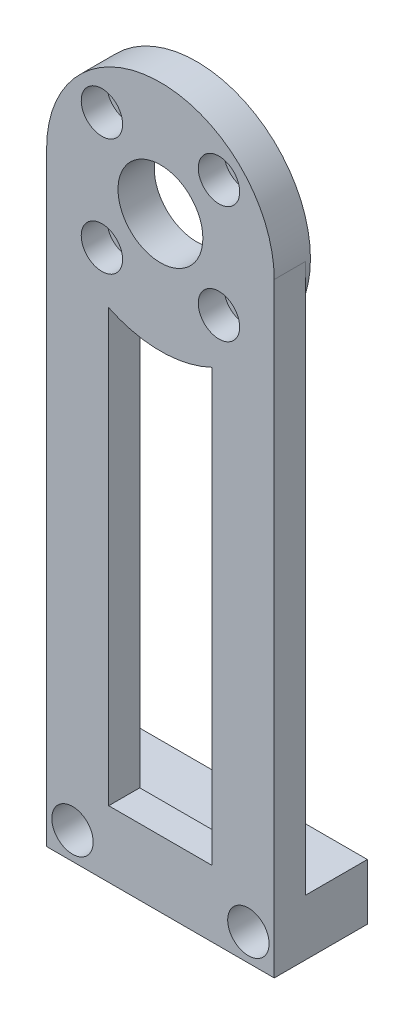
ISO-10303-21;
HEADER;
FILE_DESCRIPTION(('STEP AP214'),'2;1');
FILE_NAME('part.step','',(''),(''),'','','');
FILE_SCHEMA(('AUTOMOTIVE_DESIGN { 1 0 10303 214 1 1 1 1 }'));
ENDSEC;
DATA;
#1=APPLICATION_CONTEXT('core data for automotive mechanical design processes');
#2=APPLICATION_PROTOCOL_DEFINITION('international standard','automotive_design',2000,#1);
#3=PRODUCT_CONTEXT('',#1,'mechanical');
#4=PRODUCT('Part','Part','',(#3));
#5=PRODUCT_RELATED_PRODUCT_CATEGORY('part','',(#4));
#6=PRODUCT_DEFINITION_FORMATION('','',#4);
#7=PRODUCT_DEFINITION_CONTEXT('part definition',#1,'design');
#8=PRODUCT_DEFINITION('design','',#6,#7);
#9=PRODUCT_DEFINITION_SHAPE('','',#8);
#10=(LENGTH_UNIT() NAMED_UNIT(*) SI_UNIT(.MILLI.,.METRE.));
#11=(NAMED_UNIT(*) PLANE_ANGLE_UNIT() SI_UNIT($,.RADIAN.));
#12=(NAMED_UNIT(*) SI_UNIT($,.STERADIAN.) SOLID_ANGLE_UNIT());
#13=UNCERTAINTY_MEASURE_WITH_UNIT(LENGTH_MEASURE(1.E-05),#10,'distance_accuracy_value','');
#14=(GEOMETRIC_REPRESENTATION_CONTEXT(3) GLOBAL_UNCERTAINTY_ASSIGNED_CONTEXT((#13)) GLOBAL_UNIT_ASSIGNED_CONTEXT((#10,
#11,#12)) REPRESENTATION_CONTEXT('',''));
#15=CARTESIAN_POINT('',(0.,0.,0.));
#16=DIRECTION('',(0.,0.,1.));
#17=DIRECTION('',(1.,0.,0.));
#18=AXIS2_PLACEMENT_3D('',#15,#16,#17);
#19=CARTESIAN_POINT('',(8.5,-26.62018786,-9.11126983722081));
#20=DIRECTION('',(0.,0.,1.));
#21=DIRECTION('',(1.,0.,0.));
#22=AXIS2_PLACEMENT_3D('',#19,#20,#21);
#23=CYLINDRICAL_SURFACE('',#22,1.1);
#24=CARTESIAN_POINT('',(8.5,-26.62018786,-6.));
#25=DIRECTION('',(0.,0.,1.));
#26=DIRECTION('',(1.,0.,0.));
#27=AXIS2_PLACEMENT_3D('',#24,#25,#26);
#28=CIRCLE('',#27,1.1);
#29=CARTESIAN_POINT('',(9.6,-26.62018786,-6.));
#30=VERTEX_POINT('',#29);
#31=EDGE_CURVE('E182',#30,#30,#28,.F.);
#32=ORIENTED_EDGE('',*,*,#31,.T.);
#33=EDGE_LOOP('',(#32));
#34=FACE_BOUND('',#33,.T.);
#35=CARTESIAN_POINT('',(8.5,-26.62018786,-5.));
#36=DIRECTION('',(0.,0.,1.));
#37=DIRECTION('',(1.,0.,0.));
#38=AXIS2_PLACEMENT_3D('',#35,#36,#37);
#39=CIRCLE('',#38,1.1);
#40=CARTESIAN_POINT('',(9.6,-26.62018786,-5.));
#41=VERTEX_POINT('',#40);
#42=EDGE_CURVE('E726',#41,#41,#39,.F.);
#43=ORIENTED_EDGE('',*,*,#42,.F.);
#44=EDGE_LOOP('',(#43));
#45=FACE_BOUND('',#44,.T.);
#46=ADVANCED_FACE('F73',(#34,#45),#23,.F.);
#47=CARTESIAN_POINT('',(-8.5,-26.62018786,-9.11126983722081));
#48=DIRECTION('',(0.,0.,1.));
#49=DIRECTION('',(1.,0.,0.));
#50=AXIS2_PLACEMENT_3D('',#47,#48,#49);
#51=CYLINDRICAL_SURFACE('',#50,1.1);
#52=CARTESIAN_POINT('',(-8.5,-26.62018786,-6.));
#53=DIRECTION('',(0.,0.,1.));
#54=DIRECTION('',(1.,0.,0.));
#55=AXIS2_PLACEMENT_3D('',#52,#53,#54);
#56=CIRCLE('',#55,1.1);
#57=CARTESIAN_POINT('',(-7.4,-26.62018786,-6.));
#58=VERTEX_POINT('',#57);
#59=EDGE_CURVE('E179',#58,#58,#56,.F.);
#60=ORIENTED_EDGE('',*,*,#59,.T.);
#61=EDGE_LOOP('',(#60));
#62=FACE_BOUND('',#61,.T.);
#63=CARTESIAN_POINT('',(-8.5,-26.62018786,-5.));
#64=DIRECTION('',(0.,0.,1.));
#65=DIRECTION('',(1.,0.,0.));
#66=AXIS2_PLACEMENT_3D('',#63,#64,#65);
#67=CIRCLE('',#66,1.1);
#68=CARTESIAN_POINT('',(-7.4,-26.62018786,-5.));
#69=VERTEX_POINT('',#68);
#70=EDGE_CURVE('E742',#69,#69,#67,.F.);
#71=ORIENTED_EDGE('',*,*,#70,.F.);
#72=EDGE_LOOP('',(#71));
#73=FACE_BOUND('',#72,.T.);
#74=ADVANCED_FACE('F390',(#62,#73),#51,.F.);
#75=CARTESIAN_POINT('',(-5.65685424949235,23.5781457505076,-12.0965512114594));
#76=DIRECTION('',(0.,0.,1.));
#77=DIRECTION('',(1.,0.,0.));
#78=AXIS2_PLACEMENT_3D('',#75,#76,#77);
#79=CYLINDRICAL_SURFACE('',#78,1.10000000000001);
#80=CARTESIAN_POINT('',(-5.65685424949235,23.5781457505076,-0.5));
#81=DIRECTION('',(0.,0.,1.));
#82=DIRECTION('',(1.,0.,0.));
#83=AXIS2_PLACEMENT_3D('',#80,#81,#82);
#84=CIRCLE('',#83,1.10000000000001);
#85=CARTESIAN_POINT('',(-4.55685424949234,23.5781457505076,-0.5));
#86=VERTEX_POINT('',#85);
#87=EDGE_CURVE('E234',#86,#86,#84,.F.);
#88=ORIENTED_EDGE('',*,*,#87,.T.);
#89=EDGE_LOOP('',(#88));
#90=FACE_BOUND('',#89,.T.);
#91=CARTESIAN_POINT('',(-5.65685424949235,23.5781457505076,0.5));
#92=DIRECTION('',(0.,0.,1.));
#93=DIRECTION('',(1.,0.,0.));
#94=AXIS2_PLACEMENT_3D('',#91,#92,#93);
#95=CIRCLE('',#94,1.10000000000001);
#96=CARTESIAN_POINT('',(-4.55685424949234,23.5781457505076,0.5));
#97=VERTEX_POINT('',#96);
#98=EDGE_CURVE('E216',#97,#97,#95,.F.);
#99=ORIENTED_EDGE('',*,*,#98,.F.);
#100=EDGE_LOOP('',(#99));
#101=FACE_BOUND('',#100,.T.);
#102=ADVANCED_FACE('F396',(#90,#101),#79,.F.);
#103=CARTESIAN_POINT('',(-5.65685424949244,34.8918542494923,-12.0965512114594));
#104=DIRECTION('',(0.,0.,1.));
#105=DIRECTION('',(1.,0.,0.));
#106=AXIS2_PLACEMENT_3D('',#103,#104,#105);
#107=CYLINDRICAL_SURFACE('',#106,1.10000000000001);
#108=CARTESIAN_POINT('',(-5.65685424949244,34.8918542494923,-0.5));
#109=DIRECTION('',(0.,0.,1.));
#110=DIRECTION('',(1.,0.,0.));
#111=AXIS2_PLACEMENT_3D('',#108,#109,#110);
#112=CIRCLE('',#111,1.10000000000001);
#113=CARTESIAN_POINT('',(-4.55685424949243,34.8918542494923,-0.5));
#114=VERTEX_POINT('',#113);
#115=EDGE_CURVE('E238',#114,#114,#112,.F.);
#116=ORIENTED_EDGE('',*,*,#115,.T.);
#117=EDGE_LOOP('',(#116));
#118=FACE_BOUND('',#117,.T.);
#119=CARTESIAN_POINT('',(-5.65685424949244,34.8918542494923,0.5));
#120=DIRECTION('',(0.,0.,1.));
#121=DIRECTION('',(1.,0.,0.));
#122=AXIS2_PLACEMENT_3D('',#119,#120,#121);
#123=CIRCLE('',#122,1.10000000000001);
#124=CARTESIAN_POINT('',(-4.55685424949243,34.8918542494923,0.5));
#125=VERTEX_POINT('',#124);
#126=EDGE_CURVE('E203',#125,#125,#123,.F.);
#127=ORIENTED_EDGE('',*,*,#126,.F.);
#128=EDGE_LOOP('',(#127));
#129=FACE_BOUND('',#128,.T.);
#130=ADVANCED_FACE('F436',(#118,#129),#107,.F.);
#131=CARTESIAN_POINT('',(5.65685424949247,23.5781457505077,-12.0965512114594));
#132=DIRECTION('',(0.,0.,1.));
#133=DIRECTION('',(1.,0.,0.));
#134=AXIS2_PLACEMENT_3D('',#131,#132,#133);
#135=CYLINDRICAL_SURFACE('',#134,1.10000000000001);
#136=CARTESIAN_POINT('',(5.65685424949247,23.5781457505077,-0.5));
#137=DIRECTION('',(0.,0.,1.));
#138=DIRECTION('',(1.,0.,0.));
#139=AXIS2_PLACEMENT_3D('',#136,#137,#138);
#140=CIRCLE('',#139,1.10000000000001);
#141=CARTESIAN_POINT('',(6.75685424949248,23.5781457505077,-0.5));
#142=VERTEX_POINT('',#141);
#143=EDGE_CURVE('E211',#142,#142,#140,.F.);
#144=ORIENTED_EDGE('',*,*,#143,.T.);
#145=EDGE_LOOP('',(#144));
#146=FACE_BOUND('',#145,.T.);
#147=CARTESIAN_POINT('',(5.65685424949247,23.5781457505077,0.5));
#148=DIRECTION('',(0.,0.,1.));
#149=DIRECTION('',(1.,0.,0.));
#150=AXIS2_PLACEMENT_3D('',#147,#148,#149);
#151=CIRCLE('',#150,1.10000000000001);
#152=CARTESIAN_POINT('',(6.75685424949248,23.5781457505077,0.5));
#153=VERTEX_POINT('',#152);
#154=EDGE_CURVE('E195',#153,#153,#151,.F.);
#155=ORIENTED_EDGE('',*,*,#154,.F.);
#156=EDGE_LOOP('',(#155));
#157=FACE_BOUND('',#156,.T.);
#158=ADVANCED_FACE('F440',(#146,#157),#135,.F.);
#159=CARTESIAN_POINT('',(5.65685424949235,34.8918542494924,-12.0965512114594));
#160=DIRECTION('',(0.,0.,1.));
#161=DIRECTION('',(1.,0.,0.));
#162=AXIS2_PLACEMENT_3D('',#159,#160,#161);
#163=CYLINDRICAL_SURFACE('',#162,1.10000000000001);
#164=CARTESIAN_POINT('',(5.65685424949235,34.8918542494924,-0.5));
#165=DIRECTION('',(0.,0.,1.));
#166=DIRECTION('',(1.,0.,0.));
#167=AXIS2_PLACEMENT_3D('',#164,#165,#166);
#168=CIRCLE('',#167,1.10000000000001);
#169=CARTESIAN_POINT('',(6.75685424949236,34.8918542494924,-0.5));
#170=VERTEX_POINT('',#169);
#171=EDGE_CURVE('E257',#170,#170,#168,.F.);
#172=ORIENTED_EDGE('',*,*,#171,.T.);
#173=EDGE_LOOP('',(#172));
#174=FACE_BOUND('',#173,.T.);
#175=CARTESIAN_POINT('',(5.65685424949235,34.8918542494924,0.5));
#176=DIRECTION('',(0.,0.,1.));
#177=DIRECTION('',(1.,0.,0.));
#178=AXIS2_PLACEMENT_3D('',#175,#176,#177);
#179=CIRCLE('',#178,1.10000000000001);
#180=CARTESIAN_POINT('',(6.75685424949236,34.8918542494924,0.5));
#181=VERTEX_POINT('',#180);
#182=EDGE_CURVE('E242',#181,#181,#179,.F.);
#183=ORIENTED_EDGE('',*,*,#182,.F.);
#184=EDGE_LOOP('',(#183));
#185=FACE_BOUND('',#184,.T.);
#186=ADVANCED_FACE('F352',(#174,#185),#163,.F.);
#187=CARTESIAN_POINT('',(0.,0.,0.));
#188=DIRECTION('',(0.,0.,1.));
#189=DIRECTION('',(1.,0.,0.));
#190=AXIS2_PLACEMENT_3D('',#187,#188,#189);
#191=PLANE('',#190);
#192=DIRECTION('',(0.,-1.,0.));
#193=VECTOR('',#192,1.);
#194=CARTESIAN_POINT('',(11.,0.,0.));
#195=LINE('',#194,#193);
#196=CARTESIAN_POINT('',(11.,29.235,0.));
#197=VERTEX_POINT('',#196);
#198=CARTESIAN_POINT('',(11.,-23.815,0.));
#199=VERTEX_POINT('',#198);
#200=EDGE_CURVE('E95',#197,#199,#195,.T.);
#201=ORIENTED_EDGE('',*,*,#200,.T.);
#202=DIRECTION('',(-1.,0.,0.));
#203=VECTOR('',#202,1.);
#204=CARTESIAN_POINT('',(0.,-23.815,0.));
#205=LINE('',#204,#203);
#206=CARTESIAN_POINT('',(-11.,-23.815,0.));
#207=VERTEX_POINT('',#206);
#208=EDGE_CURVE('E91',#199,#207,#205,.T.);
#209=ORIENTED_EDGE('',*,*,#208,.T.);
#210=DIRECTION('',(0.,-1.,0.));
#211=VECTOR('',#210,1.);
#212=CARTESIAN_POINT('',(-11.,0.,0.));
#213=LINE('',#212,#211);
#214=CARTESIAN_POINT('',(-11.,29.235,0.));
#215=VERTEX_POINT('',#214);
#216=EDGE_CURVE('E301',#215,#207,#213,.T.);
#217=ORIENTED_EDGE('',*,*,#216,.F.);
#218=CARTESIAN_POINT('',(0.,29.235,0.));
#219=DIRECTION('',(0.,0.,1.));
#220=DIRECTION('',(1.,0.,0.));
#221=AXIS2_PLACEMENT_3D('',#218,#219,#220);
#222=CIRCLE('',#221,11.);
#223=EDGE_CURVE('E13',#215,#197,#222,.T.);
#224=ORIENTED_EDGE('',*,*,#223,.T.);
#225=EDGE_LOOP('',(#201,#209,#217,#224));
#226=FACE_BOUND('',#225,.T.);
#227=CARTESIAN_POINT('',(0.,29.235,0.));
#228=DIRECTION('',(0.,0.,1.));
#229=DIRECTION('',(1.,0.,0.));
#230=AXIS2_PLACEMENT_3D('',#227,#228,#229);
#231=CIRCLE('',#230,11.5);
#232=CARTESIAN_POINT('',(-5.,18.878842411396,0.));
#233=VERTEX_POINT('',#232);
#234=CARTESIAN_POINT('',(4.99999999999999,18.878842411396,0.));
#235=VERTEX_POINT('',#234);
#236=EDGE_CURVE('E304',#233,#235,#231,.T.);
#237=ORIENTED_EDGE('',*,*,#236,.F.);
#238=DIRECTION('',(0.,-1.,0.));
#239=VECTOR('',#238,1.);
#240=CARTESIAN_POINT('',(-4.99999999999999,0.,0.));
#241=LINE('',#240,#239);
#242=CARTESIAN_POINT('',(-4.99999999999998,-22.815,0.));
#243=VERTEX_POINT('',#242);
#244=EDGE_CURVE('E275',#233,#243,#241,.T.);
#245=ORIENTED_EDGE('',*,*,#244,.T.);
#246=DIRECTION('',(1.,0.,0.));
#247=VECTOR('',#246,1.);
#248=CARTESIAN_POINT('',(0.,-22.815,0.));
#249=LINE('',#248,#247);
#250=CARTESIAN_POINT('',(5.00000000000002,-22.815,0.));
#251=VERTEX_POINT('',#250);
#252=EDGE_CURVE('E312',#243,#251,#249,.T.);
#253=ORIENTED_EDGE('',*,*,#252,.T.);
#254=DIRECTION('',(0.,-1.,0.));
#255=VECTOR('',#254,1.);
#256=CARTESIAN_POINT('',(5.,0.,0.));
#257=LINE('',#256,#255);
#258=EDGE_CURVE('E308',#235,#251,#257,.T.);
#259=ORIENTED_EDGE('',*,*,#258,.F.);
#260=EDGE_LOOP('',(#237,#245,#253,#259));
#261=FACE_BOUND('',#260,.T.);
#262=ADVANCED_FACE('F349',(#226,#261),#191,.F.);
#263=CARTESIAN_POINT('',(0.,-29.235,3.));
#264=DIRECTION('',(0.,1.,0.));
#265=DIRECTION('',(0.,0.,1.));
#266=AXIS2_PLACEMENT_3D('',#263,#264,#265);
#267=PLANE('',#266);
#268=DIRECTION('',(0.,0.,-1.));
#269=VECTOR('',#268,1.);
#270=CARTESIAN_POINT('',(-11.,-29.235,3.));
#271=LINE('',#270,#269);
#272=CARTESIAN_POINT('',(-11.,-29.235,3.));
#273=VERTEX_POINT('',#272);
#274=CARTESIAN_POINT('',(-11.,-29.235,-6.));
#275=VERTEX_POINT('',#274);
#276=EDGE_CURVE('E175',#273,#275,#271,.T.);
#277=ORIENTED_EDGE('',*,*,#276,.T.);
#278=DIRECTION('',(1.,0.,0.));
#279=VECTOR('',#278,1.);
#280=CARTESIAN_POINT('',(0.,-29.235,-6.));
#281=LINE('',#280,#279);
#282=CARTESIAN_POINT('',(11.,-29.235,-6.));
#283=VERTEX_POINT('',#282);
#284=EDGE_CURVE('E167',#275,#283,#281,.T.);
#285=ORIENTED_EDGE('',*,*,#284,.T.);
#286=DIRECTION('',(0.,0.,-1.));
#287=VECTOR('',#286,1.);
#288=CARTESIAN_POINT('',(11.,-29.235,3.));
#289=LINE('',#288,#287);
#290=CARTESIAN_POINT('',(11.,-29.235,3.));
#291=VERTEX_POINT('',#290);
#292=EDGE_CURVE('E77',#291,#283,#289,.T.);
#293=ORIENTED_EDGE('',*,*,#292,.F.);
#294=DIRECTION('',(1.,0.,0.));
#295=VECTOR('',#294,1.);
#296=CARTESIAN_POINT('',(0.,-29.235,3.));
#297=LINE('',#296,#295);
#298=EDGE_CURVE('E281',#273,#291,#297,.T.);
#299=ORIENTED_EDGE('',*,*,#298,.F.);
#300=EDGE_LOOP('',(#277,#285,#293,#299));
#301=FACE_BOUND('',#300,.T.);
#302=ADVANCED_FACE('F173',(#301),#267,.F.);
#303=CARTESIAN_POINT('',(-11.,0.,3.));
#304=DIRECTION('',(1.,0.,0.));
#305=DIRECTION('',(0.,1.,0.));
#306=AXIS2_PLACEMENT_3D('',#303,#304,#305);
#307=PLANE('',#306);
#308=ORIENTED_EDGE('',*,*,#276,.F.);
#309=DIRECTION('',(0.,-1.,0.));
#310=VECTOR('',#309,1.);
#311=CARTESIAN_POINT('',(-11.,0.,3.));
#312=LINE('',#311,#310);
#313=CARTESIAN_POINT('',(-11.,29.235,3.));
#314=VERTEX_POINT('',#313);
#315=EDGE_CURVE('E278',#314,#273,#312,.T.);
#316=ORIENTED_EDGE('',*,*,#315,.F.);
#317=DIRECTION('',(0.,0.,-1.));
#318=VECTOR('',#317,1.);
#319=CARTESIAN_POINT('',(-11.,29.235,3.));
#320=LINE('',#319,#318);
#321=EDGE_CURVE('E334',#314,#215,#320,.T.);
#322=ORIENTED_EDGE('',*,*,#321,.T.);
#323=ORIENTED_EDGE('',*,*,#216,.T.);
#324=DIRECTION('',(0.,0.,1.));
#325=VECTOR('',#324,1.);
#326=CARTESIAN_POINT('',(-11.,-23.815,-6.));
#327=LINE('',#326,#325);
#328=CARTESIAN_POINT('',(-11.,-23.815,-6.));
#329=VERTEX_POINT('',#328);
#330=EDGE_CURVE('E191',#329,#207,#327,.T.);
#331=ORIENTED_EDGE('',*,*,#330,.F.);
#332=DIRECTION('',(0.,-1.,0.));
#333=VECTOR('',#332,1.);
#334=CARTESIAN_POINT('',(-11.,0.,-6.));
#335=LINE('',#334,#333);
#336=EDGE_CURVE('E187',#329,#275,#335,.T.);
#337=ORIENTED_EDGE('',*,*,#336,.T.);
#338=EDGE_LOOP('',(#308,#316,#322,#323,#331,#337));
#339=FACE_BOUND('',#338,.T.);
#340=ADVANCED_FACE('F347',(#339),#307,.F.);
#341=CARTESIAN_POINT('',(0.,0.,3.));
#342=DIRECTION('',(0.,0.,1.));
#343=DIRECTION('',(1.,0.,0.));
#344=AXIS2_PLACEMENT_3D('',#341,#342,#343);
#345=PLANE('',#344);
#346=CARTESIAN_POINT('',(-8.5,-26.62018786,3.));
#347=DIRECTION('',(0.,0.,1.));
#348=DIRECTION('',(1.,0.,0.));
#349=AXIS2_PLACEMENT_3D('',#346,#347,#348);
#350=CIRCLE('',#349,2.);
#351=CARTESIAN_POINT('',(-6.5,-26.62018786,3.));
#352=VERTEX_POINT('',#351);
#353=EDGE_CURVE('E728',#352,#352,#350,.T.);
#354=ORIENTED_EDGE('',*,*,#353,.F.);
#355=EDGE_LOOP('',(#354));
#356=FACE_BOUND('',#355,.T.);
#357=CARTESIAN_POINT('',(8.5,-26.62018786,3.));
#358=DIRECTION('',(0.,0.,1.));
#359=DIRECTION('',(1.,0.,0.));
#360=AXIS2_PLACEMENT_3D('',#357,#358,#359);
#361=CIRCLE('',#360,2.);
#362=CARTESIAN_POINT('',(10.5,-26.62018786,3.));
#363=VERTEX_POINT('',#362);
#364=EDGE_CURVE('E735',#363,#363,#361,.T.);
#365=ORIENTED_EDGE('',*,*,#364,.F.);
#366=EDGE_LOOP('',(#365));
#367=FACE_BOUND('',#366,.T.);
#368=CARTESIAN_POINT('',(-5.65685424949244,34.8918542494923,3.));
#369=DIRECTION('',(0.,0.,1.));
#370=DIRECTION('',(0.,1.,0.));
#371=AXIS2_PLACEMENT_3D('',#368,#369,#370);
#372=CIRCLE('',#371,2.00000000000001);
#373=CARTESIAN_POINT('',(-5.65685424949244,36.8918542494923,3.));
#374=VERTEX_POINT('',#373);
#375=EDGE_CURVE('E198',#374,#374,#372,.T.);
#376=ORIENTED_EDGE('',*,*,#375,.F.);
#377=EDGE_LOOP('',(#376));
#378=FACE_BOUND('',#377,.T.);
#379=CARTESIAN_POINT('',(-5.65685424949235,23.5781457505076,3.));
#380=DIRECTION('',(0.,0.,1.));
#381=DIRECTION('',(-1.,0.,0.));
#382=AXIS2_PLACEMENT_3D('',#379,#380,#381);
#383=CIRCLE('',#382,2.00000000000001);
#384=CARTESIAN_POINT('',(-7.65685424949236,23.5781457505076,3.));
#385=VERTEX_POINT('',#384);
#386=EDGE_CURVE('E212',#385,#385,#383,.T.);
#387=ORIENTED_EDGE('',*,*,#386,.F.);
#388=EDGE_LOOP('',(#387));
#389=FACE_BOUND('',#388,.T.);
#390=CARTESIAN_POINT('',(5.65685424949247,23.5781457505077,3.));
#391=DIRECTION('',(0.,0.,1.));
#392=DIRECTION('',(0.,-1.,0.));
#393=AXIS2_PLACEMENT_3D('',#390,#391,#392);
#394=CIRCLE('',#393,2.00000000000001);
#395=CARTESIAN_POINT('',(5.65685424949249,21.5781457505077,3.));
#396=VERTEX_POINT('',#395);
#397=EDGE_CURVE('E224',#396,#396,#394,.T.);
#398=ORIENTED_EDGE('',*,*,#397,.F.);
#399=EDGE_LOOP('',(#398));
#400=FACE_BOUND('',#399,.T.);
#401=CARTESIAN_POINT('',(5.65685424949235,34.8918542494924,3.));
#402=DIRECTION('',(0.,0.,1.));
#403=DIRECTION('',(1.,0.,0.));
#404=AXIS2_PLACEMENT_3D('',#401,#402,#403);
#405=CIRCLE('',#404,2.00000000000001);
#406=CARTESIAN_POINT('',(7.65685424949235,34.8918542494924,3.));
#407=VERTEX_POINT('',#406);
#408=EDGE_CURVE('E246',#407,#407,#405,.T.);
#409=ORIENTED_EDGE('',*,*,#408,.F.);
#410=EDGE_LOOP('',(#409));
#411=FACE_BOUND('',#410,.T.);
#412=CARTESIAN_POINT('',(0.,29.235,3.));
#413=DIRECTION('',(0.,0.,1.));
#414=DIRECTION('',(1.,0.,0.));
#415=AXIS2_PLACEMENT_3D('',#412,#413,#414);
#416=CIRCLE('',#415,4.1);
#417=CARTESIAN_POINT('',(4.1,29.235,3.));
#418=VERTEX_POINT('',#417);
#419=EDGE_CURVE('E258',#418,#418,#416,.T.);
#420=ORIENTED_EDGE('',*,*,#419,.F.);
#421=EDGE_LOOP('',(#420));
#422=FACE_BOUND('',#421,.T.);
#423=ORIENTED_EDGE('',*,*,#298,.T.);
#424=DIRECTION('',(0.,-1.,0.));
#425=VECTOR('',#424,1.);
#426=CARTESIAN_POINT('',(11.,0.,3.));
#427=LINE('',#426,#425);
#428=CARTESIAN_POINT('',(11.,29.235,3.));
#429=VERTEX_POINT('',#428);
#430=EDGE_CURVE('E157',#429,#291,#427,.T.);
#431=ORIENTED_EDGE('',*,*,#430,.F.);
#432=CARTESIAN_POINT('',(0.,29.235,3.));
#433=DIRECTION('',(0.,0.,1.));
#434=DIRECTION('',(1.,0.,0.));
#435=AXIS2_PLACEMENT_3D('',#432,#433,#434);
#436=CIRCLE('',#435,11.);
#437=EDGE_CURVE('E274',#429,#314,#436,.T.);
#438=ORIENTED_EDGE('',*,*,#437,.T.);
#439=ORIENTED_EDGE('',*,*,#315,.T.);
#440=EDGE_LOOP('',(#423,#431,#438,#439));
#441=FACE_BOUND('',#440,.T.);
#442=CARTESIAN_POINT('',(0.,29.235,3.));
#443=DIRECTION('',(0.,0.,1.));
#444=DIRECTION('',(1.,0.,0.));
#445=AXIS2_PLACEMENT_3D('',#442,#443,#444);
#446=CIRCLE('',#445,11.5);
#447=CARTESIAN_POINT('',(-5.,18.878842411396,3.));
#448=VERTEX_POINT('',#447);
#449=CARTESIAN_POINT('',(4.99999999999999,18.878842411396,3.));
#450=VERTEX_POINT('',#449);
#451=EDGE_CURVE('E284',#448,#450,#446,.T.);
#452=ORIENTED_EDGE('',*,*,#451,.T.);
#453=DIRECTION('',(0.,-1.,0.));
#454=VECTOR('',#453,1.);
#455=CARTESIAN_POINT('',(5.,0.,3.));
#456=LINE('',#455,#454);
#457=CARTESIAN_POINT('',(5.00000000000002,-22.815,3.));
#458=VERTEX_POINT('',#457);
#459=EDGE_CURVE('E288',#450,#458,#456,.T.);
#460=ORIENTED_EDGE('',*,*,#459,.T.);
#461=DIRECTION('',(1.,0.,0.));
#462=VECTOR('',#461,1.);
#463=CARTESIAN_POINT('',(0.,-22.815,3.));
#464=LINE('',#463,#462);
#465=CARTESIAN_POINT('',(-4.99999999999998,-22.815,3.));
#466=VERTEX_POINT('',#465);
#467=EDGE_CURVE('E291',#466,#458,#464,.T.);
#468=ORIENTED_EDGE('',*,*,#467,.F.);
#469=DIRECTION('',(0.,-1.,0.));
#470=VECTOR('',#469,1.);
#471=CARTESIAN_POINT('',(-4.99999999999999,0.,3.));
#472=LINE('',#471,#470);
#473=EDGE_CURVE('E295',#448,#466,#472,.T.);
#474=ORIENTED_EDGE('',*,*,#473,.F.);
#475=EDGE_LOOP('',(#452,#460,#468,#474));
#476=FACE_BOUND('',#475,.T.);
#477=ADVANCED_FACE('F371',(#356,#367,#378,#389,#400,#411,#422,#441,#476),#345,.T.);
#478=CARTESIAN_POINT('',(11.,0.,3.));
#479=DIRECTION('',(1.,0.,0.));
#480=DIRECTION('',(0.,1.,0.));
#481=AXIS2_PLACEMENT_3D('',#478,#479,#480);
#482=PLANE('',#481);
#483=ORIENTED_EDGE('',*,*,#200,.F.);
#484=DIRECTION('',(0.,0.,-1.));
#485=VECTOR('',#484,1.);
#486=CARTESIAN_POINT('',(11.,29.235,3.));
#487=LINE('',#486,#485);
#488=EDGE_CURVE('E323',#429,#197,#487,.T.);
#489=ORIENTED_EDGE('',*,*,#488,.F.);
#490=ORIENTED_EDGE('',*,*,#430,.T.);
#491=ORIENTED_EDGE('',*,*,#292,.T.);
#492=DIRECTION('',(0.,-1.,0.));
#493=VECTOR('',#492,1.);
#494=CARTESIAN_POINT('',(11.,0.,-6.));
#495=LINE('',#494,#493);
#496=CARTESIAN_POINT('',(11.,-23.815,-6.));
#497=VERTEX_POINT('',#496);
#498=EDGE_CURVE('E154',#497,#283,#495,.T.);
#499=ORIENTED_EDGE('',*,*,#498,.F.);
#500=DIRECTION('',(0.,0.,1.));
#501=VECTOR('',#500,1.);
#502=CARTESIAN_POINT('',(11.,-23.815,-6.));
#503=LINE('',#502,#501);
#504=EDGE_CURVE('E189',#497,#199,#503,.T.);
#505=ORIENTED_EDGE('',*,*,#504,.T.);
#506=EDGE_LOOP('',(#483,#489,#490,#491,#499,#505));
#507=FACE_BOUND('',#506,.T.);
#508=ADVANCED_FACE('F75',(#507),#482,.T.);
#509=CARTESIAN_POINT('',(0.,29.235,3.));
#510=DIRECTION('',(0.,0.,-1.));
#511=DIRECTION('',(-1.,0.,0.));
#512=AXIS2_PLACEMENT_3D('',#509,#510,#511);
#513=CYLINDRICAL_SURFACE('',#512,11.);
#514=ORIENTED_EDGE('',*,*,#488,.T.);
#515=ORIENTED_EDGE('',*,*,#223,.F.);
#516=ORIENTED_EDGE('',*,*,#321,.F.);
#517=ORIENTED_EDGE('',*,*,#437,.F.);
#518=EDGE_LOOP('',(#514,#515,#516,#517));
#519=FACE_BOUND('',#518,.T.);
#520=CARTESIAN_POINT('',(0.,29.235,-0.5));
#521=DIRECTION('',(0.,0.,1.));
#522=DIRECTION('',(1.,0.,0.));
#523=AXIS2_PLACEMENT_3D('',#520,#521,#522);
#524=CIRCLE('',#523,11.);
#525=CARTESIAN_POINT('',(11.,29.235,-0.5));
#526=VERTEX_POINT('',#525);
#527=EDGE_CURVE('E162',#526,#526,#524,.T.);
#528=ORIENTED_EDGE('',*,*,#527,.T.);
#529=EDGE_LOOP('',(#528));
#530=FACE_BOUND('',#529,.T.);
#531=ADVANCED_FACE('F341',(#519,#530),#513,.T.);
#532=CARTESIAN_POINT('',(5.,0.,3.));
#533=DIRECTION('',(1.,0.,0.));
#534=DIRECTION('',(0.,1.,0.));
#535=AXIS2_PLACEMENT_3D('',#532,#533,#534);
#536=PLANE('',#535);
#537=ORIENTED_EDGE('',*,*,#258,.T.);
#538=DIRECTION('',(0.,0.,-1.));
#539=VECTOR('',#538,1.);
#540=CARTESIAN_POINT('',(5.00000000000002,-22.815,3.));
#541=LINE('',#540,#539);
#542=EDGE_CURVE('E326',#458,#251,#541,.T.);
#543=ORIENTED_EDGE('',*,*,#542,.F.);
#544=ORIENTED_EDGE('',*,*,#459,.F.);
#545=DIRECTION('',(0.,0.,-1.));
#546=VECTOR('',#545,1.);
#547=CARTESIAN_POINT('',(4.99999999999999,18.878842411396,3.));
#548=LINE('',#547,#546);
#549=EDGE_CURVE('E83',#450,#235,#548,.T.);
#550=ORIENTED_EDGE('',*,*,#549,.T.);
#551=EDGE_LOOP('',(#537,#543,#544,#550));
#552=FACE_BOUND('',#551,.T.);
#553=ADVANCED_FACE('F368',(#552),#536,.F.);
#554=CARTESIAN_POINT('',(0.,-22.815,3.));
#555=DIRECTION('',(0.,1.,0.));
#556=DIRECTION('',(0.,0.,1.));
#557=AXIS2_PLACEMENT_3D('',#554,#555,#556);
#558=PLANE('',#557);
#559=ORIENTED_EDGE('',*,*,#252,.F.);
#560=DIRECTION('',(0.,0.,-1.));
#561=VECTOR('',#560,1.);
#562=CARTESIAN_POINT('',(-4.99999999999998,-22.815,3.));
#563=LINE('',#562,#561);
#564=EDGE_CURVE('E322',#466,#243,#563,.T.);
#565=ORIENTED_EDGE('',*,*,#564,.F.);
#566=ORIENTED_EDGE('',*,*,#467,.T.);
#567=ORIENTED_EDGE('',*,*,#542,.T.);
#568=EDGE_LOOP('',(#559,#565,#566,#567));
#569=FACE_BOUND('',#568,.T.);
#570=ADVANCED_FACE('F365',(#569),#558,.T.);
#571=CARTESIAN_POINT('',(-4.99999999999999,0.,3.));
#572=DIRECTION('',(1.,0.,0.));
#573=DIRECTION('',(0.,1.,0.));
#574=AXIS2_PLACEMENT_3D('',#571,#572,#573);
#575=PLANE('',#574);
#576=ORIENTED_EDGE('',*,*,#244,.F.);
#577=DIRECTION('',(0.,0.,-1.));
#578=VECTOR('',#577,1.);
#579=CARTESIAN_POINT('',(-5.,18.878842411396,3.));
#580=LINE('',#579,#578);
#581=EDGE_CURVE('E319',#448,#233,#580,.T.);
#582=ORIENTED_EDGE('',*,*,#581,.F.);
#583=ORIENTED_EDGE('',*,*,#473,.T.);
#584=ORIENTED_EDGE('',*,*,#564,.T.);
#585=EDGE_LOOP('',(#576,#582,#583,#584));
#586=FACE_BOUND('',#585,.T.);
#587=ADVANCED_FACE('F359',(#586),#575,.T.);
#588=CARTESIAN_POINT('',(0.,29.235,3.));
#589=DIRECTION('',(0.,0.,-1.));
#590=DIRECTION('',(-1.,0.,0.));
#591=AXIS2_PLACEMENT_3D('',#588,#589,#590);
#592=CYLINDRICAL_SURFACE('',#591,11.5);
#593=ORIENTED_EDGE('',*,*,#236,.T.);
#594=ORIENTED_EDGE('',*,*,#549,.F.);
#595=ORIENTED_EDGE('',*,*,#451,.F.);
#596=ORIENTED_EDGE('',*,*,#581,.T.);
#597=EDGE_LOOP('',(#593,#594,#595,#596));
#598=FACE_BOUND('',#597,.T.);
#599=ADVANCED_FACE('F369',(#598),#592,.T.);
#600=CARTESIAN_POINT('',(0.,0.,-0.5));
#601=DIRECTION('',(0.,0.,1.));
#602=DIRECTION('',(1.,0.,0.));
#603=AXIS2_PLACEMENT_3D('',#600,#601,#602);
#604=PLANE('',#603);
#605=ORIENTED_EDGE('',*,*,#143,.F.);
#606=EDGE_LOOP('',(#605));
#607=FACE_BOUND('',#606,.T.);
#608=ORIENTED_EDGE('',*,*,#115,.F.);
#609=EDGE_LOOP('',(#608));
#610=FACE_BOUND('',#609,.T.);
#611=ORIENTED_EDGE('',*,*,#87,.F.);
#612=EDGE_LOOP('',(#611));
#613=FACE_BOUND('',#612,.T.);
#614=CARTESIAN_POINT('',(0.,29.235,-0.5));
#615=DIRECTION('',(0.,0.,1.));
#616=DIRECTION('',(1.,0.,0.));
#617=AXIS2_PLACEMENT_3D('',#614,#615,#616);
#618=CIRCLE('',#617,4.1);
#619=CARTESIAN_POINT('',(4.1,29.235,-0.5));
#620=VERTEX_POINT('',#619);
#621=EDGE_CURVE('E262',#620,#620,#618,.F.);
#622=ORIENTED_EDGE('',*,*,#621,.F.);
#623=EDGE_LOOP('',(#622));
#624=FACE_BOUND('',#623,.T.);
#625=ORIENTED_EDGE('',*,*,#171,.F.);
#626=EDGE_LOOP('',(#625));
#627=FACE_BOUND('',#626,.T.);
#628=ORIENTED_EDGE('',*,*,#527,.F.);
#629=EDGE_LOOP('',(#628));
#630=FACE_BOUND('',#629,.T.);
#631=ADVANCED_FACE('F375',(#607,#610,#613,#624,#627,#630),#604,.F.);
#632=CARTESIAN_POINT('',(0.,29.235,-12.0965512114594));
#633=DIRECTION('',(0.,0.,1.));
#634=DIRECTION('',(1.,0.,0.));
#635=AXIS2_PLACEMENT_3D('',#632,#633,#634);
#636=CYLINDRICAL_SURFACE('',#635,4.1);
#637=ORIENTED_EDGE('',*,*,#621,.T.);
#638=EDGE_LOOP('',(#637));
#639=FACE_BOUND('',#638,.T.);
#640=ORIENTED_EDGE('',*,*,#419,.T.);
#641=EDGE_LOOP('',(#640));
#642=FACE_BOUND('',#641,.T.);
#643=ADVANCED_FACE('F385',(#639,#642),#636,.F.);
#644=CARTESIAN_POINT('',(5.65685424949235,34.8918542494924,-6.1568542494924));
#645=DIRECTION('',(0.,0.,1.));
#646=DIRECTION('',(1.,0.,0.));
#647=AXIS2_PLACEMENT_3D('',#644,#645,#646);
#648=CYLINDRICAL_SURFACE('',#647,2.00000000000001);
#649=CARTESIAN_POINT('',(5.65685424949235,34.8918542494924,0.5));
#650=DIRECTION('',(0.,0.,1.));
#651=DIRECTION('',(1.,0.,0.));
#652=AXIS2_PLACEMENT_3D('',#649,#650,#651);
#653=CIRCLE('',#652,2.00000000000001);
#654=CARTESIAN_POINT('',(7.65685424949235,34.8918542494924,0.5));
#655=VERTEX_POINT('',#654);
#656=EDGE_CURVE('E250',#655,#655,#653,.F.);
#657=ORIENTED_EDGE('',*,*,#656,.T.);
#658=EDGE_LOOP('',(#657));
#659=FACE_BOUND('',#658,.T.);
#660=ORIENTED_EDGE('',*,*,#408,.T.);
#661=EDGE_LOOP('',(#660));
#662=FACE_BOUND('',#661,.T.);
#663=ADVANCED_FACE('F445',(#659,#662),#648,.F.);
#664=CARTESIAN_POINT('',(0.,0.,0.5));
#665=DIRECTION('',(0.,0.,1.));
#666=DIRECTION('',(1.,0.,0.));
#667=AXIS2_PLACEMENT_3D('',#664,#665,#666);
#668=PLANE('',#667);
#669=ORIENTED_EDGE('',*,*,#656,.F.);
#670=EDGE_LOOP('',(#669));
#671=FACE_BOUND('',#670,.T.);
#672=ORIENTED_EDGE('',*,*,#182,.T.);
#673=EDGE_LOOP('',(#672));
#674=FACE_BOUND('',#673,.T.);
#675=ADVANCED_FACE('F429',(#671,#674),#668,.T.);
#676=CARTESIAN_POINT('',(5.65685424949247,23.5781457505077,-6.1568542494924));
#677=DIRECTION('',(0.,0.,1.));
#678=DIRECTION('',(1.,0.,0.));
#679=AXIS2_PLACEMENT_3D('',#676,#677,#678);
#680=CYLINDRICAL_SURFACE('',#679,2.00000000000001);
#681=CARTESIAN_POINT('',(5.65685424949247,23.5781457505077,0.5));
#682=DIRECTION('',(0.,0.,1.));
#683=DIRECTION('',(1.,0.,0.));
#684=AXIS2_PLACEMENT_3D('',#681,#682,#683);
#685=CIRCLE('',#684,2.00000000000001);
#686=CARTESIAN_POINT('',(7.65685424949248,23.5781457505077,0.5));
#687=VERTEX_POINT('',#686);
#688=EDGE_CURVE('E220',#687,#687,#685,.F.);
#689=ORIENTED_EDGE('',*,*,#688,.T.);
#690=EDGE_LOOP('',(#689));
#691=FACE_BOUND('',#690,.T.);
#692=ORIENTED_EDGE('',*,*,#397,.T.);
#693=EDGE_LOOP('',(#692));
#694=FACE_BOUND('',#693,.T.);
#695=ADVANCED_FACE('F426',(#691,#694),#680,.F.);
#696=CARTESIAN_POINT('',(0.,0.,0.5));
#697=DIRECTION('',(0.,0.,1.));
#698=DIRECTION('',(1.,0.,0.));
#699=AXIS2_PLACEMENT_3D('',#696,#697,#698);
#700=PLANE('',#699);
#701=ORIENTED_EDGE('',*,*,#688,.F.);
#702=EDGE_LOOP('',(#701));
#703=FACE_BOUND('',#702,.T.);
#704=ORIENTED_EDGE('',*,*,#154,.T.);
#705=EDGE_LOOP('',(#704));
#706=FACE_BOUND('',#705,.T.);
#707=ADVANCED_FACE('F414',(#703,#706),#700,.T.);
#708=CARTESIAN_POINT('',(-5.65685424949244,34.8918542494923,-6.1568542494924));
#709=DIRECTION('',(0.,0.,1.));
#710=DIRECTION('',(1.,0.,0.));
#711=AXIS2_PLACEMENT_3D('',#708,#709,#710);
#712=CYLINDRICAL_SURFACE('',#711,2.00000000000001);
#713=CARTESIAN_POINT('',(-5.65685424949244,34.8918542494923,0.5));
#714=DIRECTION('',(0.,0.,1.));
#715=DIRECTION('',(1.,0.,0.));
#716=AXIS2_PLACEMENT_3D('',#713,#714,#715);
#717=CIRCLE('',#716,2.00000000000001);
#718=CARTESIAN_POINT('',(-3.65685424949243,34.8918542494923,0.5));
#719=VERTEX_POINT('',#718);
#720=EDGE_CURVE('E202',#719,#719,#717,.F.);
#721=ORIENTED_EDGE('',*,*,#720,.T.);
#722=EDGE_LOOP('',(#721));
#723=FACE_BOUND('',#722,.T.);
#724=ORIENTED_EDGE('',*,*,#375,.T.);
#725=EDGE_LOOP('',(#724));
#726=FACE_BOUND('',#725,.T.);
#727=ADVANCED_FACE('F410',(#723,#726),#712,.F.);
#728=CARTESIAN_POINT('',(0.,0.,0.5));
#729=DIRECTION('',(0.,0.,1.));
#730=DIRECTION('',(1.,0.,0.));
#731=AXIS2_PLACEMENT_3D('',#728,#729,#730);
#732=PLANE('',#731);
#733=ORIENTED_EDGE('',*,*,#720,.F.);
#734=EDGE_LOOP('',(#733));
#735=FACE_BOUND('',#734,.T.);
#736=ORIENTED_EDGE('',*,*,#126,.T.);
#737=EDGE_LOOP('',(#736));
#738=FACE_BOUND('',#737,.T.);
#739=ADVANCED_FACE('F413',(#735,#738),#732,.T.);
#740=CARTESIAN_POINT('',(-5.65685424949235,23.5781457505076,-6.1568542494924));
#741=DIRECTION('',(0.,0.,1.));
#742=DIRECTION('',(1.,0.,0.));
#743=AXIS2_PLACEMENT_3D('',#740,#741,#742);
#744=CYLINDRICAL_SURFACE('',#743,2.00000000000001);
#745=CARTESIAN_POINT('',(-5.65685424949235,23.5781457505076,0.5));
#746=DIRECTION('',(0.,0.,1.));
#747=DIRECTION('',(1.,0.,0.));
#748=AXIS2_PLACEMENT_3D('',#745,#746,#747);
#749=CIRCLE('',#748,2.00000000000001);
#750=CARTESIAN_POINT('',(-3.65685424949235,23.5781457505076,0.5));
#751=VERTEX_POINT('',#750);
#752=EDGE_CURVE('E207',#751,#751,#749,.F.);
#753=ORIENTED_EDGE('',*,*,#752,.T.);
#754=EDGE_LOOP('',(#753));
#755=FACE_BOUND('',#754,.T.);
#756=ORIENTED_EDGE('',*,*,#386,.T.);
#757=EDGE_LOOP('',(#756));
#758=FACE_BOUND('',#757,.T.);
#759=ADVANCED_FACE('F418',(#755,#758),#744,.F.);
#760=CARTESIAN_POINT('',(0.,0.,0.5));
#761=DIRECTION('',(0.,0.,1.));
#762=DIRECTION('',(1.,0.,0.));
#763=AXIS2_PLACEMENT_3D('',#760,#761,#762);
#764=PLANE('',#763);
#765=ORIENTED_EDGE('',*,*,#752,.F.);
#766=EDGE_LOOP('',(#765));
#767=FACE_BOUND('',#766,.T.);
#768=ORIENTED_EDGE('',*,*,#98,.T.);
#769=EDGE_LOOP('',(#768));
#770=FACE_BOUND('',#769,.T.);
#771=ADVANCED_FACE('F409',(#767,#770),#764,.T.);
#772=CARTESIAN_POINT('',(0.,-23.815,-6.));
#773=DIRECTION('',(0.,1.,0.));
#774=DIRECTION('',(0.,0.,1.));
#775=AXIS2_PLACEMENT_3D('',#772,#773,#774);
#776=PLANE('',#775);
#777=ORIENTED_EDGE('',*,*,#208,.F.);
#778=ORIENTED_EDGE('',*,*,#504,.F.);
#779=DIRECTION('',(-1.,0.,0.));
#780=VECTOR('',#779,1.);
#781=CARTESIAN_POINT('',(0.,-23.815,-6.));
#782=LINE('',#781,#780);
#783=EDGE_CURVE('E170',#497,#329,#782,.T.);
#784=ORIENTED_EDGE('',*,*,#783,.T.);
#785=ORIENTED_EDGE('',*,*,#330,.T.);
#786=EDGE_LOOP('',(#777,#778,#784,#785));
#787=FACE_BOUND('',#786,.T.);
#788=ADVANCED_FACE('F345',(#787),#776,.T.);
#789=CARTESIAN_POINT('',(0.,0.,-6.));
#790=DIRECTION('',(0.,0.,1.));
#791=DIRECTION('',(1.,0.,0.));
#792=AXIS2_PLACEMENT_3D('',#789,#790,#791);
#793=PLANE('',#792);
#794=ORIENTED_EDGE('',*,*,#59,.F.);
#795=EDGE_LOOP('',(#794));
#796=FACE_BOUND('',#795,.T.);
#797=ORIENTED_EDGE('',*,*,#31,.F.);
#798=EDGE_LOOP('',(#797));
#799=FACE_BOUND('',#798,.T.);
#800=ORIENTED_EDGE('',*,*,#284,.F.);
#801=ORIENTED_EDGE('',*,*,#336,.F.);
#802=ORIENTED_EDGE('',*,*,#783,.F.);
#803=ORIENTED_EDGE('',*,*,#498,.T.);
#804=EDGE_LOOP('',(#800,#801,#802,#803));
#805=FACE_BOUND('',#804,.T.);
#806=ADVANCED_FACE('F165',(#796,#799,#805),#793,.F.);
#807=CARTESIAN_POINT('',(-8.5,-26.62018786,-11.6568542494924));
#808=DIRECTION('',(0.,0.,1.));
#809=DIRECTION('',(1.,0.,0.));
#810=AXIS2_PLACEMENT_3D('',#807,#808,#809);
#811=CYLINDRICAL_SURFACE('',#810,2.);
#812=CARTESIAN_POINT('',(-8.5,-26.62018786,-5.));
#813=DIRECTION('',(0.,0.,1.));
#814=DIRECTION('',(1.,0.,0.));
#815=AXIS2_PLACEMENT_3D('',#812,#813,#814);
#816=CIRCLE('',#815,2.);
#817=CARTESIAN_POINT('',(-6.5,-26.62018786,-5.));
#818=VERTEX_POINT('',#817);
#819=EDGE_CURVE('E733',#818,#818,#816,.F.);
#820=ORIENTED_EDGE('',*,*,#819,.T.);
#821=EDGE_LOOP('',(#820));
#822=FACE_BOUND('',#821,.T.);
#823=ORIENTED_EDGE('',*,*,#353,.T.);
#824=EDGE_LOOP('',(#823));
#825=FACE_BOUND('',#824,.T.);
#826=ADVANCED_FACE('F405',(#822,#825),#811,.F.);
#827=CARTESIAN_POINT('',(0.,0.,-5.));
#828=DIRECTION('',(0.,0.,1.));
#829=DIRECTION('',(1.,0.,0.));
#830=AXIS2_PLACEMENT_3D('',#827,#828,#829);
#831=PLANE('',#830);
#832=ORIENTED_EDGE('',*,*,#819,.F.);
#833=EDGE_LOOP('',(#832));
#834=FACE_BOUND('',#833,.T.);
#835=ORIENTED_EDGE('',*,*,#70,.T.);
#836=EDGE_LOOP('',(#835));
#837=FACE_BOUND('',#836,.T.);
#838=ADVANCED_FACE('F541',(#834,#837),#831,.T.);
#839=CARTESIAN_POINT('',(8.5,-26.62018786,-11.6568542494924));
#840=DIRECTION('',(0.,0.,1.));
#841=DIRECTION('',(1.,0.,0.));
#842=AXIS2_PLACEMENT_3D('',#839,#840,#841);
#843=CYLINDRICAL_SURFACE('',#842,2.);
#844=CARTESIAN_POINT('',(8.5,-26.62018786,-5.));
#845=DIRECTION('',(0.,0.,1.));
#846=DIRECTION('',(1.,0.,0.));
#847=AXIS2_PLACEMENT_3D('',#844,#845,#846);
#848=CIRCLE('',#847,2.);
#849=CARTESIAN_POINT('',(10.5,-26.62018786,-5.));
#850=VERTEX_POINT('',#849);
#851=EDGE_CURVE('E723',#850,#850,#848,.F.);
#852=ORIENTED_EDGE('',*,*,#851,.T.);
#853=EDGE_LOOP('',(#852));
#854=FACE_BOUND('',#853,.T.);
#855=ORIENTED_EDGE('',*,*,#364,.T.);
#856=EDGE_LOOP('',(#855));
#857=FACE_BOUND('',#856,.T.);
#858=ADVANCED_FACE('F549',(#854,#857),#843,.F.);
#859=CARTESIAN_POINT('',(0.,0.,-5.));
#860=DIRECTION('',(0.,0.,1.));
#861=DIRECTION('',(1.,0.,0.));
#862=AXIS2_PLACEMENT_3D('',#859,#860,#861);
#863=PLANE('',#862);
#864=ORIENTED_EDGE('',*,*,#851,.F.);
#865=EDGE_LOOP('',(#864));
#866=FACE_BOUND('',#865,.T.);
#867=ORIENTED_EDGE('',*,*,#42,.T.);
#868=EDGE_LOOP('',(#867));
#869=FACE_BOUND('',#868,.T.);
#870=ADVANCED_FACE('F557',(#866,#869),#863,.T.);
#871=CLOSED_SHELL('',(#46,#74,#102,#130,#158,#186,#262,#302,#340,#477,#508,#531,#553,#570,#587,
#599,#631,#643,#663,#675,#695,#707,#727,#739,#759,#771,#788,#806,#826,#838,#858,#870));
#872=MANIFOLD_SOLID_BREP('B2',#871);
#873=ADVANCED_BREP_SHAPE_REPRESENTATION('',(#18,#872),#14);
#874=SHAPE_DEFINITION_REPRESENTATION(#9,#873);
ENDSEC;
END-ISO-10303-21;
